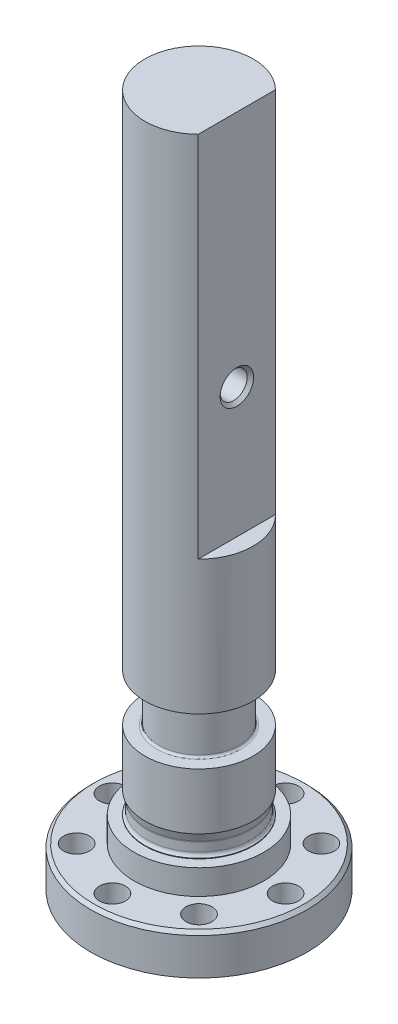
ISO-10303-21;
HEADER;
FILE_DESCRIPTION(('STEP AP214'),'2;1');
FILE_NAME('part.step','',(''),(''),'','','');
FILE_SCHEMA(('AUTOMOTIVE_DESIGN { 1 0 10303 214 1 1 1 1 }'));
ENDSEC;
DATA;
#1=APPLICATION_CONTEXT('core data for automotive mechanical design processes');
#2=APPLICATION_PROTOCOL_DEFINITION('international standard','automotive_design',2000,#1);
#3=PRODUCT_CONTEXT('',#1,'mechanical');
#4=PRODUCT('Part','Part','',(#3));
#5=PRODUCT_RELATED_PRODUCT_CATEGORY('part','',(#4));
#6=PRODUCT_DEFINITION_FORMATION('','',#4);
#7=PRODUCT_DEFINITION_CONTEXT('part definition',#1,'design');
#8=PRODUCT_DEFINITION('design','',#6,#7);
#9=PRODUCT_DEFINITION_SHAPE('','',#8);
#10=(LENGTH_UNIT() NAMED_UNIT(*) SI_UNIT(.MILLI.,.METRE.));
#11=(NAMED_UNIT(*) PLANE_ANGLE_UNIT() SI_UNIT($,.RADIAN.));
#12=(NAMED_UNIT(*) SI_UNIT($,.STERADIAN.) SOLID_ANGLE_UNIT());
#13=UNCERTAINTY_MEASURE_WITH_UNIT(LENGTH_MEASURE(1.E-05),#10,'distance_accuracy_value','');
#14=(GEOMETRIC_REPRESENTATION_CONTEXT(3) GLOBAL_UNCERTAINTY_ASSIGNED_CONTEXT((#13)) GLOBAL_UNIT_ASSIGNED_CONTEXT((#10,
#11,#12)) REPRESENTATION_CONTEXT('',''));
#15=CARTESIAN_POINT('',(0.,0.,0.));
#16=DIRECTION('',(0.,0.,1.));
#17=DIRECTION('',(1.,0.,0.));
#18=AXIS2_PLACEMENT_3D('',#15,#16,#17);
#19=CARTESIAN_POINT('',(0.,64.,0.));
#20=DIRECTION('',(0.,-1.,0.));
#21=DIRECTION('',(0.,0.,-1.));
#22=AXIS2_PLACEMENT_3D('',#19,#20,#21);
#23=CYLINDRICAL_SURFACE('',#22,5.);
#24=CARTESIAN_POINT('',(0.,8.,0.));
#25=DIRECTION('',(0.,-1.,0.));
#26=DIRECTION('',(0.,0.,-1.));
#27=AXIS2_PLACEMENT_3D('',#24,#25,#26);
#28=CIRCLE('',#27,5.);
#29=CARTESIAN_POINT('',(0.,8.,-5.));
#30=VERTEX_POINT('',#29);
#31=EDGE_CURVE('E145',#30,#30,#28,.T.);
#32=ORIENTED_EDGE('',*,*,#31,.F.);
#33=EDGE_LOOP('',(#32));
#34=FACE_BOUND('',#33,.T.);
#35=CARTESIAN_POINT('',(0.,13.2,0.));
#36=DIRECTION('',(0.,-1.,0.));
#37=DIRECTION('',(0.,0.,-1.));
#38=AXIS2_PLACEMENT_3D('',#35,#36,#37);
#39=CIRCLE('',#38,5.);
#40=CARTESIAN_POINT('',(0.,13.2,-5.));
#41=VERTEX_POINT('',#40);
#42=EDGE_CURVE('E160',#41,#41,#39,.T.);
#43=ORIENTED_EDGE('',*,*,#42,.T.);
#44=EDGE_LOOP('',(#43));
#45=FACE_BOUND('',#44,.T.);
#46=ADVANCED_FACE('F19',(#34,#45),#23,.T.);
#47=CARTESIAN_POINT('',(0.,6.,0.));
#48=DIRECTION('',(0.,1.,0.));
#49=DIRECTION('',(0.,0.,1.));
#50=AXIS2_PLACEMENT_3D('',#47,#48,#49);
#51=CIRCLE('',#50,5.);
#52=CARTESIAN_POINT('',(0.,6.,5.));
#53=VERTEX_POINT('',#52);
#54=EDGE_CURVE('E80',#53,#53,#51,.T.);
#55=ORIENTED_EDGE('',*,*,#54,.T.);
#56=EDGE_LOOP('',(#55));
#57=FACE_BOUND('',#56,.T.);
#58=CARTESIAN_POINT('',(0.,6.05358983848622,0.));
#59=DIRECTION('',(0.,1.,0.));
#60=DIRECTION('',(0.,0.,1.));
#61=AXIS2_PLACEMENT_3D('',#58,#59,#60);
#62=CIRCLE('',#61,5.);
#63=CARTESIAN_POINT('',(0.,6.05358983848622,5.));
#64=VERTEX_POINT('',#63);
#65=EDGE_CURVE('E140',#64,#64,#62,.T.);
#66=ORIENTED_EDGE('',*,*,#65,.F.);
#67=EDGE_LOOP('',(#66));
#68=FACE_BOUND('',#67,.T.);
#69=ADVANCED_FACE('F227',(#57,#68),#23,.T.);
#70=CARTESIAN_POINT('',(0.,6.,0.));
#71=DIRECTION('',(0.,1.,0.));
#72=DIRECTION('',(0.,0.,1.));
#73=AXIS2_PLACEMENT_3D('',#70,#71,#72);
#74=PLANE('',#73);
#75=CARTESIAN_POINT('',(0.,6.,0.));
#76=DIRECTION('',(0.,-1.,0.));
#77=DIRECTION('',(0.,0.,-1.));
#78=AXIS2_PLACEMENT_3D('',#75,#76,#77);
#79=CIRCLE('',#78,6.);
#80=CARTESIAN_POINT('',(0.,6.,-6.));
#81=VERTEX_POINT('',#80);
#82=EDGE_CURVE('E144',#81,#81,#79,.T.);
#83=ORIENTED_EDGE('',*,*,#82,.F.);
#84=EDGE_LOOP('',(#83));
#85=FACE_BOUND('',#84,.T.);
#86=ORIENTED_EDGE('',*,*,#54,.F.);
#87=EDGE_LOOP('',(#86));
#88=FACE_BOUND('',#87,.T.);
#89=ADVANCED_FACE('F219',(#85,#88),#74,.T.);
#90=CARTESIAN_POINT('',(-10.,3.7,0.));
#91=DIRECTION('',(0.,1.,0.));
#92=DIRECTION('',(0.,0.,1.));
#93=AXIS2_PLACEMENT_3D('',#90,#91,#92);
#94=PLANE('',#93);
#95=CARTESIAN_POINT('',(0.,3.7,0.));
#96=DIRECTION('',(0.,1.,0.));
#97=DIRECTION('',(0.,0.,1.));
#98=AXIS2_PLACEMENT_3D('',#95,#96,#97);
#99=CIRCLE('',#98,9.7);
#100=CARTESIAN_POINT('',(0.,3.7,9.7));
#101=VERTEX_POINT('',#100);
#102=EDGE_CURVE('E135',#101,#101,#99,.T.);
#103=ORIENTED_EDGE('',*,*,#102,.T.);
#104=EDGE_LOOP('',(#103));
#105=FACE_BOUND('',#104,.T.);
#106=CARTESIAN_POINT('',(0.,3.7,-8.));
#107=DIRECTION('',(0.,1.,0.));
#108=DIRECTION('',(0.,0.,1.));
#109=AXIS2_PLACEMENT_3D('',#106,#107,#108);
#110=CIRCLE('',#109,1.2);
#111=CARTESIAN_POINT('',(0.,3.7,-6.8));
#112=VERTEX_POINT('',#111);
#113=EDGE_CURVE('E89',#112,#112,#110,.T.);
#114=ORIENTED_EDGE('',*,*,#113,.F.);
#115=EDGE_LOOP('',(#114));
#116=FACE_BOUND('',#115,.T.);
#117=CARTESIAN_POINT('',(5.65685424949238,3.7,-5.65685424949238));
#118=DIRECTION('',(0.,1.,0.));
#119=DIRECTION('',(0.,0.,1.));
#120=AXIS2_PLACEMENT_3D('',#117,#118,#119);
#121=CIRCLE('',#120,1.2);
#122=CARTESIAN_POINT('',(5.65685424949238,3.7,-4.45685424949238));
#123=VERTEX_POINT('',#122);
#124=EDGE_CURVE('E303',#123,#123,#121,.T.);
#125=ORIENTED_EDGE('',*,*,#124,.F.);
#126=EDGE_LOOP('',(#125));
#127=FACE_BOUND('',#126,.T.);
#128=CARTESIAN_POINT('',(8.,3.7,0.));
#129=DIRECTION('',(0.,1.,0.));
#130=DIRECTION('',(0.,0.,1.));
#131=AXIS2_PLACEMENT_3D('',#128,#129,#130);
#132=CIRCLE('',#131,1.2);
#133=CARTESIAN_POINT('',(8.,3.7,1.2));
#134=VERTEX_POINT('',#133);
#135=EDGE_CURVE('E300',#134,#134,#132,.T.);
#136=ORIENTED_EDGE('',*,*,#135,.F.);
#137=EDGE_LOOP('',(#136));
#138=FACE_BOUND('',#137,.T.);
#139=CARTESIAN_POINT('',(5.65685424949238,3.7,5.65685424949238));
#140=DIRECTION('',(0.,1.,0.));
#141=DIRECTION('',(0.,0.,1.));
#142=AXIS2_PLACEMENT_3D('',#139,#140,#141);
#143=CIRCLE('',#142,1.2);
#144=CARTESIAN_POINT('',(5.65685424949238,3.7,6.85685424949238));
#145=VERTEX_POINT('',#144);
#146=EDGE_CURVE('E296',#145,#145,#143,.T.);
#147=ORIENTED_EDGE('',*,*,#146,.F.);
#148=EDGE_LOOP('',(#147));
#149=FACE_BOUND('',#148,.T.);
#150=CARTESIAN_POINT('',(0.,3.7,8.));
#151=DIRECTION('',(0.,1.,0.));
#152=DIRECTION('',(0.,0.,1.));
#153=AXIS2_PLACEMENT_3D('',#150,#151,#152);
#154=CIRCLE('',#153,1.2);
#155=CARTESIAN_POINT('',(0.,3.7,9.2));
#156=VERTEX_POINT('',#155);
#157=EDGE_CURVE('E292',#156,#156,#154,.T.);
#158=ORIENTED_EDGE('',*,*,#157,.F.);
#159=EDGE_LOOP('',(#158));
#160=FACE_BOUND('',#159,.T.);
#161=CARTESIAN_POINT('',(-5.65685424949238,3.7,5.65685424949238));
#162=DIRECTION('',(0.,1.,0.));
#163=DIRECTION('',(0.,0.,1.));
#164=AXIS2_PLACEMENT_3D('',#161,#162,#163);
#165=CIRCLE('',#164,1.2);
#166=CARTESIAN_POINT('',(-5.65685424949238,3.7,6.85685424949238));
#167=VERTEX_POINT('',#166);
#168=EDGE_CURVE('E288',#167,#167,#165,.T.);
#169=ORIENTED_EDGE('',*,*,#168,.F.);
#170=EDGE_LOOP('',(#169));
#171=FACE_BOUND('',#170,.T.);
#172=CARTESIAN_POINT('',(-8.,3.7,0.));
#173=DIRECTION('',(0.,1.,0.));
#174=DIRECTION('',(0.,0.,1.));
#175=AXIS2_PLACEMENT_3D('',#172,#173,#174);
#176=CIRCLE('',#175,1.2);
#177=CARTESIAN_POINT('',(-8.,3.7,1.2));
#178=VERTEX_POINT('',#177);
#179=EDGE_CURVE('E130',#178,#178,#176,.T.);
#180=ORIENTED_EDGE('',*,*,#179,.F.);
#181=EDGE_LOOP('',(#180));
#182=FACE_BOUND('',#181,.T.);
#183=CARTESIAN_POINT('',(-5.65685424949238,3.7,-5.65685424949238));
#184=DIRECTION('',(0.,1.,0.));
#185=DIRECTION('',(0.,0.,1.));
#186=AXIS2_PLACEMENT_3D('',#183,#184,#185);
#187=CIRCLE('',#186,1.2);
#188=CARTESIAN_POINT('',(-5.65685424949238,3.7,-4.45685424949238));
#189=VERTEX_POINT('',#188);
#190=EDGE_CURVE('E126',#189,#189,#187,.T.);
#191=ORIENTED_EDGE('',*,*,#190,.F.);
#192=EDGE_LOOP('',(#191));
#193=FACE_BOUND('',#192,.T.);
#194=CARTESIAN_POINT('',(0.,3.7,0.));
#195=DIRECTION('',(0.,-1.,0.));
#196=DIRECTION('',(0.,0.,-1.));
#197=AXIS2_PLACEMENT_3D('',#194,#195,#196);
#198=CIRCLE('',#197,6.);
#199=CARTESIAN_POINT('',(0.,3.7,-6.));
#200=VERTEX_POINT('',#199);
#201=EDGE_CURVE('E131',#200,#200,#198,.T.);
#202=ORIENTED_EDGE('',*,*,#201,.T.);
#203=EDGE_LOOP('',(#202));
#204=FACE_BOUND('',#203,.T.);
#205=ADVANCED_FACE('F216',(#105,#116,#127,#138,#149,#160,#171,#182,#193,#204),#94,.T.);
#206=CARTESIAN_POINT('',(0.,0.,0.));
#207=DIRECTION('',(0.,-1.,0.));
#208=DIRECTION('',(0.,0.,-1.));
#209=AXIS2_PLACEMENT_3D('',#206,#207,#208);
#210=CYLINDRICAL_SURFACE('',#209,6.);
#211=ORIENTED_EDGE('',*,*,#82,.T.);
#212=EDGE_LOOP('',(#211));
#213=FACE_BOUND('',#212,.T.);
#214=ORIENTED_EDGE('',*,*,#201,.F.);
#215=EDGE_LOOP('',(#214));
#216=FACE_BOUND('',#215,.T.);
#217=ADVANCED_FACE('F212',(#213,#216),#210,.T.);
#218=CARTESIAN_POINT('',(-5.65685424949238,6.,5.65685424949238));
#219=DIRECTION('',(0.,-1.,0.));
#220=DIRECTION('',(0.,0.,-1.));
#221=AXIS2_PLACEMENT_3D('',#218,#219,#220);
#222=CYLINDRICAL_SURFACE('',#221,1.2);
#223=CARTESIAN_POINT('',(-5.65685424949238,0.,5.65685424949238));
#224=DIRECTION('',(0.,1.,0.));
#225=DIRECTION('',(0.,0.,1.));
#226=AXIS2_PLACEMENT_3D('',#223,#224,#225);
#227=CIRCLE('',#226,1.2);
#228=CARTESIAN_POINT('',(-5.65685424949238,0.,6.85685424949238));
#229=VERTEX_POINT('',#228);
#230=EDGE_CURVE('E97',#229,#229,#227,.T.);
#231=ORIENTED_EDGE('',*,*,#230,.F.);
#232=EDGE_LOOP('',(#231));
#233=FACE_BOUND('',#232,.T.);
#234=ORIENTED_EDGE('',*,*,#168,.T.);
#235=EDGE_LOOP('',(#234));
#236=FACE_BOUND('',#235,.T.);
#237=ADVANCED_FACE('F215',(#233,#236),#222,.F.);
#238=CARTESIAN_POINT('',(5.65685424949238,6.,5.65685424949238));
#239=DIRECTION('',(0.,-1.,0.));
#240=DIRECTION('',(0.,0.,-1.));
#241=AXIS2_PLACEMENT_3D('',#238,#239,#240);
#242=CYLINDRICAL_SURFACE('',#241,1.2);
#243=CARTESIAN_POINT('',(5.65685424949238,0.,5.65685424949238));
#244=DIRECTION('',(0.,1.,0.));
#245=DIRECTION('',(0.,0.,1.));
#246=AXIS2_PLACEMENT_3D('',#243,#244,#245);
#247=CIRCLE('',#246,1.2);
#248=CARTESIAN_POINT('',(5.65685424949238,0.,6.85685424949238));
#249=VERTEX_POINT('',#248);
#250=EDGE_CURVE('E105',#249,#249,#247,.T.);
#251=ORIENTED_EDGE('',*,*,#250,.F.);
#252=EDGE_LOOP('',(#251));
#253=FACE_BOUND('',#252,.T.);
#254=ORIENTED_EDGE('',*,*,#146,.T.);
#255=EDGE_LOOP('',(#254));
#256=FACE_BOUND('',#255,.T.);
#257=ADVANCED_FACE('F354',(#253,#256),#242,.F.);
#258=CARTESIAN_POINT('',(5.65685424949238,6.,-5.65685424949238));
#259=DIRECTION('',(0.,-1.,0.));
#260=DIRECTION('',(0.,0.,-1.));
#261=AXIS2_PLACEMENT_3D('',#258,#259,#260);
#262=CYLINDRICAL_SURFACE('',#261,1.2);
#263=CARTESIAN_POINT('',(5.65685424949238,0.,-5.65685424949238));
#264=DIRECTION('',(0.,1.,0.));
#265=DIRECTION('',(0.,0.,1.));
#266=AXIS2_PLACEMENT_3D('',#263,#264,#265);
#267=CIRCLE('',#266,1.2);
#268=CARTESIAN_POINT('',(5.65685424949238,0.,-4.45685424949238));
#269=VERTEX_POINT('',#268);
#270=EDGE_CURVE('E113',#269,#269,#267,.T.);
#271=ORIENTED_EDGE('',*,*,#270,.F.);
#272=EDGE_LOOP('',(#271));
#273=FACE_BOUND('',#272,.T.);
#274=ORIENTED_EDGE('',*,*,#124,.T.);
#275=EDGE_LOOP('',(#274));
#276=FACE_BOUND('',#275,.T.);
#277=ADVANCED_FACE('F362',(#273,#276),#262,.F.);
#278=CARTESIAN_POINT('',(0.,6.,0.));
#279=DIRECTION('',(0.,-1.,0.));
#280=DIRECTION('',(0.,0.,-1.));
#281=AXIS2_PLACEMENT_3D('',#278,#279,#280);
#282=CYLINDRICAL_SURFACE('',#281,10.);
#283=CARTESIAN_POINT('',(0.,3.4,0.));
#284=DIRECTION('',(0.,1.,0.));
#285=DIRECTION('',(0.,0.,1.));
#286=AXIS2_PLACEMENT_3D('',#283,#284,#285);
#287=CIRCLE('',#286,10.);
#288=CARTESIAN_POINT('',(0.,3.4,10.));
#289=VERTEX_POINT('',#288);
#290=EDGE_CURVE('E125',#289,#289,#287,.F.);
#291=ORIENTED_EDGE('',*,*,#290,.T.);
#292=EDGE_LOOP('',(#291));
#293=FACE_BOUND('',#292,.T.);
#294=CARTESIAN_POINT('',(0.,0.,0.));
#295=DIRECTION('',(0.,1.,0.));
#296=DIRECTION('',(0.,0.,1.));
#297=AXIS2_PLACEMENT_3D('',#294,#295,#296);
#298=CIRCLE('',#297,10.);
#299=CARTESIAN_POINT('',(0.,0.,10.));
#300=VERTEX_POINT('',#299);
#301=EDGE_CURVE('E121',#300,#300,#298,.T.);
#302=ORIENTED_EDGE('',*,*,#301,.T.);
#303=EDGE_LOOP('',(#302));
#304=FACE_BOUND('',#303,.T.);
#305=ADVANCED_FACE('F369',(#293,#304),#282,.T.);
#306=CARTESIAN_POINT('',(0.,6.,-8.));
#307=DIRECTION('',(0.,-1.,0.));
#308=DIRECTION('',(0.,0.,-1.));
#309=AXIS2_PLACEMENT_3D('',#306,#307,#308);
#310=CYLINDRICAL_SURFACE('',#309,1.2);
#311=CARTESIAN_POINT('',(0.,0.,-8.));
#312=DIRECTION('',(0.,1.,0.));
#313=DIRECTION('',(0.,0.,1.));
#314=AXIS2_PLACEMENT_3D('',#311,#312,#313);
#315=CIRCLE('',#314,1.2);
#316=CARTESIAN_POINT('',(0.,0.,-6.8));
#317=VERTEX_POINT('',#316);
#318=EDGE_CURVE('E117',#317,#317,#315,.T.);
#319=ORIENTED_EDGE('',*,*,#318,.F.);
#320=EDGE_LOOP('',(#319));
#321=FACE_BOUND('',#320,.T.);
#322=ORIENTED_EDGE('',*,*,#113,.T.);
#323=EDGE_LOOP('',(#322));
#324=FACE_BOUND('',#323,.T.);
#325=ADVANCED_FACE('F314',(#321,#324),#310,.F.);
#326=CARTESIAN_POINT('',(8.,6.,0.));
#327=DIRECTION('',(0.,-1.,0.));
#328=DIRECTION('',(0.,0.,-1.));
#329=AXIS2_PLACEMENT_3D('',#326,#327,#328);
#330=CYLINDRICAL_SURFACE('',#329,1.2);
#331=CARTESIAN_POINT('',(8.,0.,0.));
#332=DIRECTION('',(0.,1.,0.));
#333=DIRECTION('',(0.,0.,1.));
#334=AXIS2_PLACEMENT_3D('',#331,#332,#333);
#335=CIRCLE('',#334,1.2);
#336=CARTESIAN_POINT('',(8.,0.,1.2));
#337=VERTEX_POINT('',#336);
#338=EDGE_CURVE('E109',#337,#337,#335,.T.);
#339=ORIENTED_EDGE('',*,*,#338,.F.);
#340=EDGE_LOOP('',(#339));
#341=FACE_BOUND('',#340,.T.);
#342=ORIENTED_EDGE('',*,*,#135,.T.);
#343=EDGE_LOOP('',(#342));
#344=FACE_BOUND('',#343,.T.);
#345=ADVANCED_FACE('F358',(#341,#344),#330,.F.);
#346=CARTESIAN_POINT('',(0.,6.,8.));
#347=DIRECTION('',(0.,-1.,0.));
#348=DIRECTION('',(0.,0.,-1.));
#349=AXIS2_PLACEMENT_3D('',#346,#347,#348);
#350=CYLINDRICAL_SURFACE('',#349,1.2);
#351=CARTESIAN_POINT('',(0.,0.,8.));
#352=DIRECTION('',(0.,1.,0.));
#353=DIRECTION('',(0.,0.,1.));
#354=AXIS2_PLACEMENT_3D('',#351,#352,#353);
#355=CIRCLE('',#354,1.2);
#356=CARTESIAN_POINT('',(0.,0.,9.2));
#357=VERTEX_POINT('',#356);
#358=EDGE_CURVE('E101',#357,#357,#355,.T.);
#359=ORIENTED_EDGE('',*,*,#358,.F.);
#360=EDGE_LOOP('',(#359));
#361=FACE_BOUND('',#360,.T.);
#362=ORIENTED_EDGE('',*,*,#157,.T.);
#363=EDGE_LOOP('',(#362));
#364=FACE_BOUND('',#363,.T.);
#365=ADVANCED_FACE('F350',(#361,#364),#350,.F.);
#366=CARTESIAN_POINT('',(-8.,6.,0.));
#367=DIRECTION('',(0.,-1.,0.));
#368=DIRECTION('',(0.,0.,-1.));
#369=AXIS2_PLACEMENT_3D('',#366,#367,#368);
#370=CYLINDRICAL_SURFACE('',#369,1.2);
#371=CARTESIAN_POINT('',(-8.,0.,0.));
#372=DIRECTION('',(0.,1.,0.));
#373=DIRECTION('',(0.,0.,1.));
#374=AXIS2_PLACEMENT_3D('',#371,#372,#373);
#375=CIRCLE('',#374,1.2);
#376=CARTESIAN_POINT('',(-8.,0.,1.2));
#377=VERTEX_POINT('',#376);
#378=EDGE_CURVE('E86',#377,#377,#375,.T.);
#379=ORIENTED_EDGE('',*,*,#378,.F.);
#380=EDGE_LOOP('',(#379));
#381=FACE_BOUND('',#380,.T.);
#382=ORIENTED_EDGE('',*,*,#179,.T.);
#383=EDGE_LOOP('',(#382));
#384=FACE_BOUND('',#383,.T.);
#385=ADVANCED_FACE('F343',(#381,#384),#370,.F.);
#386=CARTESIAN_POINT('',(0.,0.,0.));
#387=DIRECTION('',(0.,1.,0.));
#388=DIRECTION('',(0.,0.,1.));
#389=AXIS2_PLACEMENT_3D('',#386,#387,#388);
#390=PLANE('',#389);
#391=CARTESIAN_POINT('',(0.,0.,0.));
#392=DIRECTION('',(0.,-1.,0.));
#393=DIRECTION('',(0.,0.,-1.));
#394=AXIS2_PLACEMENT_3D('',#391,#392,#393);
#395=CIRCLE('',#394,4.05);
#396=CARTESIAN_POINT('',(0.,0.,-4.05));
#397=VERTEX_POINT('',#396);
#398=EDGE_CURVE('E150',#397,#397,#395,.T.);
#399=ORIENTED_EDGE('',*,*,#398,.F.);
#400=EDGE_LOOP('',(#399));
#401=FACE_BOUND('',#400,.T.);
#402=ORIENTED_EDGE('',*,*,#378,.T.);
#403=EDGE_LOOP('',(#402));
#404=FACE_BOUND('',#403,.T.);
#405=ORIENTED_EDGE('',*,*,#358,.T.);
#406=EDGE_LOOP('',(#405));
#407=FACE_BOUND('',#406,.T.);
#408=ORIENTED_EDGE('',*,*,#338,.T.);
#409=EDGE_LOOP('',(#408));
#410=FACE_BOUND('',#409,.T.);
#411=ORIENTED_EDGE('',*,*,#318,.T.);
#412=EDGE_LOOP('',(#411));
#413=FACE_BOUND('',#412,.T.);
#414=ORIENTED_EDGE('',*,*,#301,.F.);
#415=EDGE_LOOP('',(#414));
#416=FACE_BOUND('',#415,.T.);
#417=ORIENTED_EDGE('',*,*,#270,.T.);
#418=EDGE_LOOP('',(#417));
#419=FACE_BOUND('',#418,.T.);
#420=ORIENTED_EDGE('',*,*,#250,.T.);
#421=EDGE_LOOP('',(#420));
#422=FACE_BOUND('',#421,.T.);
#423=ORIENTED_EDGE('',*,*,#230,.T.);
#424=EDGE_LOOP('',(#423));
#425=FACE_BOUND('',#424,.T.);
#426=CARTESIAN_POINT('',(-5.65685424949238,0.,-5.65685424949238));
#427=DIRECTION('',(0.,1.,0.));
#428=DIRECTION('',(0.,0.,1.));
#429=AXIS2_PLACEMENT_3D('',#426,#427,#428);
#430=CIRCLE('',#429,1.2);
#431=CARTESIAN_POINT('',(-5.65685424949238,0.,-4.45685424949238));
#432=VERTEX_POINT('',#431);
#433=EDGE_CURVE('E79',#432,#432,#430,.T.);
#434=ORIENTED_EDGE('',*,*,#433,.T.);
#435=EDGE_LOOP('',(#434));
#436=FACE_BOUND('',#435,.T.);
#437=ADVANCED_FACE('F335',(#401,#404,#407,#410,#413,#416,#419,#422,#425,#436),#390,.F.);
#438=CARTESIAN_POINT('',(-5.65685424949238,6.,-5.65685424949238));
#439=DIRECTION('',(0.,-1.,0.));
#440=DIRECTION('',(0.,0.,-1.));
#441=AXIS2_PLACEMENT_3D('',#438,#439,#440);
#442=CYLINDRICAL_SURFACE('',#441,1.2);
#443=ORIENTED_EDGE('',*,*,#433,.F.);
#444=EDGE_LOOP('',(#443));
#445=FACE_BOUND('',#444,.T.);
#446=ORIENTED_EDGE('',*,*,#190,.T.);
#447=EDGE_LOOP('',(#446));
#448=FACE_BOUND('',#447,.T.);
#449=ADVANCED_FACE('F333',(#445,#448),#442,.F.);
#450=CARTESIAN_POINT('',(0.,3.4,0.));
#451=DIRECTION('',(0.,-1.,0.));
#452=DIRECTION('',(0.,0.,-1.));
#453=AXIS2_PLACEMENT_3D('',#450,#451,#452);
#454=CONICAL_SURFACE('',#453,10.,0.78539816339744);
#455=ORIENTED_EDGE('',*,*,#102,.F.);
#456=EDGE_LOOP('',(#455));
#457=FACE_BOUND('',#456,.T.);
#458=ORIENTED_EDGE('',*,*,#290,.F.);
#459=EDGE_LOOP('',(#458));
#460=FACE_BOUND('',#459,.T.);
#461=ADVANCED_FACE('F200',(#457,#460),#454,.T.);
#462=CARTESIAN_POINT('',(0.,6.4,0.));
#463=DIRECTION('',(0.,-1.,0.));
#464=DIRECTION('',(0.,0.,-1.));
#465=AXIS2_PLACEMENT_3D('',#462,#463,#464);
#466=TOROIDAL_SURFACE('',#465,5.2,0.4);
#467=CARTESIAN_POINT('',(0.,6.4,0.));
#468=DIRECTION('',(0.,-1.,0.));
#469=DIRECTION('',(0.,0.,-1.));
#470=AXIS2_PLACEMENT_3D('',#467,#468,#469);
#471=CIRCLE('',#470,4.8);
#472=CARTESIAN_POINT('',(0.,6.4,-4.8));
#473=VERTEX_POINT('',#472);
#474=EDGE_CURVE('E265',#473,#473,#471,.T.);
#475=ORIENTED_EDGE('',*,*,#474,.T.);
#476=EDGE_LOOP('',(#475));
#477=FACE_BOUND('',#476,.T.);
#478=ORIENTED_EDGE('',*,*,#65,.T.);
#479=EDGE_LOOP('',(#478));
#480=FACE_BOUND('',#479,.T.);
#481=ADVANCED_FACE('F196',(#477,#480),#466,.F.);
#482=CARTESIAN_POINT('',(0.,7.30445645749228,0.));
#483=DIRECTION('',(0.,1.,0.));
#484=DIRECTION('',(0.,0.,1.));
#485=AXIS2_PLACEMENT_3D('',#482,#483,#484);
#486=CONICAL_SURFACE('',#485,4.81362966948437,0.261799387799151);
#487=ORIENTED_EDGE('',*,*,#31,.T.);
#488=EDGE_LOOP('',(#487));
#489=FACE_BOUND('',#488,.T.);
#490=CARTESIAN_POINT('',(0.,7.30445645749228,0.));
#491=DIRECTION('',(0.,-1.,0.));
#492=DIRECTION('',(0.,0.,-1.));
#493=AXIS2_PLACEMENT_3D('',#490,#491,#492);
#494=CIRCLE('',#493,4.81362966948437);
#495=CARTESIAN_POINT('',(0.,7.30445645749228,-4.81362966948437));
#496=VERTEX_POINT('',#495);
#497=EDGE_CURVE('E273',#496,#496,#494,.T.);
#498=ORIENTED_EDGE('',*,*,#497,.F.);
#499=EDGE_LOOP('',(#498));
#500=FACE_BOUND('',#499,.T.);
#501=ADVANCED_FACE('F199',(#489,#500),#486,.T.);
#502=CARTESIAN_POINT('',(0.,7.20092883945127,0.));
#503=DIRECTION('',(0.,-1.,0.));
#504=DIRECTION('',(0.,0.,-1.));
#505=AXIS2_PLACEMENT_3D('',#502,#503,#504);
#506=TOROIDAL_SURFACE('',#505,5.2,0.4);
#507=ORIENTED_EDGE('',*,*,#497,.T.);
#508=EDGE_LOOP('',(#507));
#509=FACE_BOUND('',#508,.T.);
#510=CARTESIAN_POINT('',(0.,7.20092883945127,0.));
#511=DIRECTION('',(0.,-1.,0.));
#512=DIRECTION('',(0.,0.,-1.));
#513=AXIS2_PLACEMENT_3D('',#510,#511,#512);
#514=CIRCLE('',#513,4.8);
#515=CARTESIAN_POINT('',(0.,7.20092883945127,-4.8));
#516=VERTEX_POINT('',#515);
#517=EDGE_CURVE('E269',#516,#516,#514,.T.);
#518=ORIENTED_EDGE('',*,*,#517,.F.);
#519=EDGE_LOOP('',(#518));
#520=FACE_BOUND('',#519,.T.);
#521=ADVANCED_FACE('F204',(#509,#520),#506,.F.);
#522=CARTESIAN_POINT('',(0.,0.,0.));
#523=DIRECTION('',(0.,-1.,0.));
#524=DIRECTION('',(0.,0.,-1.));
#525=AXIS2_PLACEMENT_3D('',#522,#523,#524);
#526=CYLINDRICAL_SURFACE('',#525,4.8);
#527=ORIENTED_EDGE('',*,*,#517,.T.);
#528=EDGE_LOOP('',(#527));
#529=FACE_BOUND('',#528,.T.);
#530=ORIENTED_EDGE('',*,*,#474,.F.);
#531=EDGE_LOOP('',(#530));
#532=FACE_BOUND('',#531,.T.);
#533=ADVANCED_FACE('F194',(#529,#532),#526,.T.);
#534=CARTESIAN_POINT('',(0.,2.,0.));
#535=DIRECTION('',(0.,-1.,0.));
#536=DIRECTION('',(0.,0.,-1.));
#537=AXIS2_PLACEMENT_3D('',#534,#535,#536);
#538=CONICAL_SURFACE('',#537,4.05,1.02974425867665);
#539=CARTESIAN_POINT('',(0.,2.93133395949272,0.));
#540=DIRECTION('',(0.,-1.,0.));
#541=DIRECTION('',(0.,0.,-1.));
#542=AXIS2_PLACEMENT_3D('',#539,#540,#541);
#543=CIRCLE('',#542,2.5);
#544=CARTESIAN_POINT('',(0.,2.93133395949272,-2.5));
#545=VERTEX_POINT('',#544);
#546=EDGE_CURVE('E146',#545,#545,#543,.F.);
#547=ORIENTED_EDGE('',*,*,#546,.T.);
#548=EDGE_LOOP('',(#547));
#549=FACE_BOUND('',#548,.T.);
#550=CARTESIAN_POINT('',(0.,2.,0.));
#551=DIRECTION('',(0.,-1.,0.));
#552=DIRECTION('',(0.,0.,-1.));
#553=AXIS2_PLACEMENT_3D('',#550,#551,#552);
#554=CIRCLE('',#553,4.05);
#555=CARTESIAN_POINT('',(0.,2.,-4.05));
#556=VERTEX_POINT('',#555);
#557=EDGE_CURVE('E261',#556,#556,#554,.T.);
#558=ORIENTED_EDGE('',*,*,#557,.T.);
#559=EDGE_LOOP('',(#558));
#560=FACE_BOUND('',#559,.T.);
#561=ADVANCED_FACE('F190',(#549,#560),#538,.F.);
#562=CARTESIAN_POINT('',(0.,0.,0.));
#563=DIRECTION('',(0.,-1.,0.));
#564=DIRECTION('',(0.,0.,-1.));
#565=AXIS2_PLACEMENT_3D('',#562,#563,#564);
#566=CYLINDRICAL_SURFACE('',#565,4.05);
#567=ORIENTED_EDGE('',*,*,#557,.F.);
#568=EDGE_LOOP('',(#567));
#569=FACE_BOUND('',#568,.T.);
#570=ORIENTED_EDGE('',*,*,#398,.T.);
#571=EDGE_LOOP('',(#570));
#572=FACE_BOUND('',#571,.T.);
#573=ADVANCED_FACE('F184',(#569,#572),#566,.F.);
#574=CARTESIAN_POINT('',(0.,0.,0.));
#575=DIRECTION('',(0.,-1.,0.));
#576=DIRECTION('',(0.,0.,-1.));
#577=AXIS2_PLACEMENT_3D('',#574,#575,#576);
#578=CYLINDRICAL_SURFACE('',#577,2.5);
#579=CARTESIAN_POINT('',(0.,4.5,0.));
#580=DIRECTION('',(0.,-1.,0.));
#581=DIRECTION('',(0.,0.,-1.));
#582=AXIS2_PLACEMENT_3D('',#579,#580,#581);
#583=CIRCLE('',#582,2.5);
#584=CARTESIAN_POINT('',(0.,4.5,-2.5));
#585=VERTEX_POINT('',#584);
#586=EDGE_CURVE('E151',#585,#585,#583,.T.);
#587=ORIENTED_EDGE('',*,*,#586,.F.);
#588=EDGE_LOOP('',(#587));
#589=FACE_BOUND('',#588,.T.);
#590=ORIENTED_EDGE('',*,*,#546,.F.);
#591=EDGE_LOOP('',(#590));
#592=FACE_BOUND('',#591,.T.);
#593=ADVANCED_FACE('F180',(#589,#592),#578,.F.);
#594=CARTESIAN_POINT('',(0.,4.5,0.));
#595=DIRECTION('',(0.,-1.,0.));
#596=DIRECTION('',(0.,0.,-1.));
#597=AXIS2_PLACEMENT_3D('',#594,#595,#596);
#598=CONICAL_SURFACE('',#597,2.5,1.02974425867665);
#599=CARTESIAN_POINT('',(0.,6.0021515475689,0.));
#600=VERTEX_POINT('',#599);
#601=VERTEX_LOOP('',#600);
#602=FACE_BOUND('',#601,.T.);
#603=ORIENTED_EDGE('',*,*,#586,.T.);
#604=EDGE_LOOP('',(#603));
#605=FACE_BOUND('',#604,.T.);
#606=ADVANCED_FACE('F183',(#602,#605),#598,.F.);
#607=CARTESIAN_POINT('',(-5.,13.2,0.));
#608=DIRECTION('',(0.,1.,0.));
#609=DIRECTION('',(0.,0.,1.));
#610=AXIS2_PLACEMENT_3D('',#607,#608,#609);
#611=PLANE('',#610);
#612=CARTESIAN_POINT('',(0.,13.2,0.));
#613=DIRECTION('',(0.,1.,0.));
#614=DIRECTION('',(0.,0.,1.));
#615=AXIS2_PLACEMENT_3D('',#612,#613,#614);
#616=CIRCLE('',#615,3.9);
#617=CARTESIAN_POINT('',(0.,13.2,3.9));
#618=VERTEX_POINT('',#617);
#619=EDGE_CURVE('E394',#618,#618,#616,.F.);
#620=ORIENTED_EDGE('',*,*,#619,.T.);
#621=EDGE_LOOP('',(#620));
#622=FACE_BOUND('',#621,.T.);
#623=ORIENTED_EDGE('',*,*,#42,.F.);
#624=EDGE_LOOP('',(#623));
#625=FACE_BOUND('',#624,.T.);
#626=ADVANCED_FACE('F173',(#622,#625),#611,.T.);
#627=CARTESIAN_POINT('',(0.,0.,0.));
#628=DIRECTION('',(0.,-1.,0.));
#629=DIRECTION('',(0.,0.,-1.));
#630=AXIS2_PLACEMENT_3D('',#627,#628,#629);
#631=CYLINDRICAL_SURFACE('',#630,3.7);
#632=CARTESIAN_POINT('',(0.,13.4,0.));
#633=DIRECTION('',(0.,1.,0.));
#634=DIRECTION('',(0.,0.,1.));
#635=AXIS2_PLACEMENT_3D('',#632,#633,#634);
#636=CIRCLE('',#635,3.7);
#637=CARTESIAN_POINT('',(0.,13.4,3.7));
#638=VERTEX_POINT('',#637);
#639=EDGE_CURVE('E28',#638,#638,#636,.T.);
#640=ORIENTED_EDGE('',*,*,#639,.T.);
#641=EDGE_LOOP('',(#640));
#642=FACE_BOUND('',#641,.T.);
#643=CARTESIAN_POINT('',(0.,17.4,0.));
#644=DIRECTION('',(0.,-1.,0.));
#645=DIRECTION('',(0.,0.,-1.));
#646=AXIS2_PLACEMENT_3D('',#643,#644,#645);
#647=CIRCLE('',#646,3.7);
#648=CARTESIAN_POINT('',(0.,17.4,-3.7));
#649=VERTEX_POINT('',#648);
#650=EDGE_CURVE('E397',#649,#649,#647,.T.);
#651=ORIENTED_EDGE('',*,*,#650,.T.);
#652=EDGE_LOOP('',(#651));
#653=FACE_BOUND('',#652,.T.);
#654=ADVANCED_FACE('F409',(#642,#653),#631,.T.);
#655=CARTESIAN_POINT('',(-5.,17.6,0.));
#656=DIRECTION('',(0.,-1.,0.));
#657=DIRECTION('',(0.,0.,-1.));
#658=AXIS2_PLACEMENT_3D('',#655,#656,#657);
#659=PLANE('',#658);
#660=CARTESIAN_POINT('',(0.,17.6,0.));
#661=DIRECTION('',(0.,-1.,0.));
#662=DIRECTION('',(0.,0.,-1.));
#663=AXIS2_PLACEMENT_3D('',#660,#661,#662);
#664=CIRCLE('',#663,3.9);
#665=CARTESIAN_POINT('',(0.,17.6,-3.9));
#666=VERTEX_POINT('',#665);
#667=EDGE_CURVE('E12',#666,#666,#664,.F.);
#668=ORIENTED_EDGE('',*,*,#667,.T.);
#669=EDGE_LOOP('',(#668));
#670=FACE_BOUND('',#669,.T.);
#671=CARTESIAN_POINT('',(0.,17.6,0.));
#672=DIRECTION('',(0.,-1.,0.));
#673=DIRECTION('',(0.,0.,-1.));
#674=AXIS2_PLACEMENT_3D('',#671,#672,#673);
#675=CIRCLE('',#674,5.);
#676=CARTESIAN_POINT('',(0.,17.6,-5.));
#677=VERTEX_POINT('',#676);
#678=EDGE_CURVE('E241',#677,#677,#675,.T.);
#679=ORIENTED_EDGE('',*,*,#678,.T.);
#680=EDGE_LOOP('',(#679));
#681=FACE_BOUND('',#680,.T.);
#682=ADVANCED_FACE('F381',(#670,#681),#659,.T.);
#683=CARTESIAN_POINT('',(3.2,42.,0.));
#684=DIRECTION('',(1.,0.,0.));
#685=DIRECTION('',(0.,0.,-1.));
#686=AXIS2_PLACEMENT_3D('',#683,#684,#685);
#687=CONICAL_SURFACE('',#686,1.25,0.785398163397444);
#688=CARTESIAN_POINT('',(3.5,42.,0.));
#689=DIRECTION('',(-1.,0.,0.));
#690=DIRECTION('',(0.,0.,1.));
#691=AXIS2_PLACEMENT_3D('',#688,#689,#690);
#692=CIRCLE('',#691,1.55);
#693=CARTESIAN_POINT('',(3.5,42.,1.55));
#694=VERTEX_POINT('',#693);
#695=EDGE_CURVE('E398',#694,#694,#692,.T.);
#696=ORIENTED_EDGE('',*,*,#695,.F.);
#697=EDGE_LOOP('',(#696));
#698=FACE_BOUND('',#697,.T.);
#699=CARTESIAN_POINT('',(3.2,42.,0.));
#700=DIRECTION('',(-1.,0.,0.));
#701=DIRECTION('',(0.,0.,1.));
#702=AXIS2_PLACEMENT_3D('',#699,#700,#701);
#703=CIRCLE('',#702,1.25);
#704=CARTESIAN_POINT('',(3.2,42.,1.25));
#705=VERTEX_POINT('',#704);
#706=EDGE_CURVE('E139',#705,#705,#703,.F.);
#707=ORIENTED_EDGE('',*,*,#706,.F.);
#708=EDGE_LOOP('',(#707));
#709=FACE_BOUND('',#708,.T.);
#710=ADVANCED_FACE('F171',(#698,#709),#687,.F.);
#711=CARTESIAN_POINT('',(3.5,42.,0.));
#712=DIRECTION('',(1.,0.,0.));
#713=DIRECTION('',(0.,0.,-1.));
#714=AXIS2_PLACEMENT_3D('',#711,#712,#713);
#715=CYLINDRICAL_SURFACE('',#714,1.25);
#716=ORIENTED_EDGE('',*,*,#706,.T.);
#717=EDGE_LOOP('',(#716));
#718=FACE_BOUND('',#717,.T.);
#719=CARTESIAN_POINT('',(-4.84122918275927,42.,-1.25));
#720=CARTESIAN_POINT('',(-4.84123050042654,42.0690253754623,-1.24999803929589));
#721=CARTESIAN_POINT('',(-4.84272153006957,42.138072449339,-1.24426312274865));
#722=CARTESIAN_POINT('',(-4.84850930996624,42.274183789087,-1.22151156273207));
#723=CARTESIAN_POINT('',(-4.85280769310907,42.3412468772342,-1.2044883533711));
#724=CARTESIAN_POINT('',(-4.86369362297984,42.4714017690935,-1.15974559981597));
#725=CARTESIAN_POINT('',(-4.87027821345205,42.5344985776929,-1.13203986392723));
#726=CARTESIAN_POINT('',(-4.88499096014404,42.65515542627,-1.0667605706307));
#727=CARTESIAN_POINT('',(-4.89311918189251,42.7127152310401,-1.02918659428034));
#728=CARTESIAN_POINT('',(-4.91020358177806,42.8219308226311,-0.944354213655933));
#729=CARTESIAN_POINT('',(-4.91917298811515,42.873446800175,-0.896918443852019));
#730=CARTESIAN_POINT('',(-4.93681437757649,42.9678806971802,-0.794091032050326));
#731=CARTESIAN_POINT('',(-4.94548633283194,43.0107978128109,-0.738698647090149));
#732=CARTESIAN_POINT('',(-4.96170207760291,43.0873877338156,-0.620572600539473));
#733=CARTESIAN_POINT('',(-4.96922843700296,43.1209231940807,-0.557747288097553));
#734=CARTESIAN_POINT('',(-4.98215405962992,43.1769048220766,-0.427131592146374));
#735=CARTESIAN_POINT('',(-4.98755363667173,43.1993526259578,-0.359341942895965));
#736=CARTESIAN_POINT('',(-4.9955237942409,43.2320739172893,-0.222179379377078));
#737=CARTESIAN_POINT('',(-4.99814946922157,43.2425848221633,-0.152866359774485));
#738=CARTESIAN_POINT('',(-5.00046797053649,43.2518791896378,-0.0134144096313822));
#739=CARTESIAN_POINT('',(-5.00016123048352,43.2506643861048,0.0567243972690362));
#740=CARTESIAN_POINT('',(-4.99669047476768,43.2367125748749,0.194190308965484));
#741=CARTESIAN_POINT('',(-4.99359001170437,43.2242318374731,0.261545269501332));
#742=CARTESIAN_POINT('',(-4.98495418262427,43.1885143649758,0.393172809267108));
#743=CARTESIAN_POINT('',(-4.9794186869922,43.1652770573113,0.45744522421305));
#744=CARTESIAN_POINT('',(-4.96643754850448,43.1084987146565,0.581758379377257));
#745=CARTESIAN_POINT('',(-4.95897509847527,43.0748664776691,0.641755637208123));
#746=CARTESIAN_POINT('',(-4.94294951904825,42.9983221604419,0.755344527925604));
#747=CARTESIAN_POINT('',(-4.93438619826245,42.9554084657197,0.808935043856881));
#748=CARTESIAN_POINT('',(-4.9168185688476,42.8601456290088,0.909717543856196));
#749=CARTESIAN_POINT('',(-4.90780859762959,42.8075725538261,0.956697098843993));
#750=CARTESIAN_POINT('',(-4.89057521758353,42.6952000132299,1.04122046995376));
#751=CARTESIAN_POINT('',(-4.88235184552985,42.6354002102545,1.07876384505751));
#752=CARTESIAN_POINT('',(-4.86760248415824,42.5098549829255,1.14348516127824));
#753=CARTESIAN_POINT('',(-4.8610849186286,42.4440821348434,1.17061195871311));
#754=CARTESIAN_POINT('',(-4.85059320069979,42.3087072659618,1.21335702579542));
#755=CARTESIAN_POINT('',(-4.84661850405109,42.2391060680085,1.22897775819113));
#756=CARTESIAN_POINT('',(-4.8417767801957,42.1000202492385,1.24791481933259));
#757=CARTESIAN_POINT('',(-4.84083044546824,42.0305811033352,1.25154523695981));
#758=CARTESIAN_POINT('',(-4.8419367174052,41.8920890317109,1.24725849525777));
#759=CARTESIAN_POINT('',(-4.84398904800633,41.8230360710244,1.23934239892439));
#760=CARTESIAN_POINT('',(-4.85078540977281,41.6884428675227,1.21246273196883));
#761=CARTESIAN_POINT('',(-4.85548485117188,41.6228636367146,1.19368203414088));
#762=CARTESIAN_POINT('',(-4.86700359135481,41.4957842710742,1.14580904083531));
#763=CARTESIAN_POINT('',(-4.87382314124306,41.4342846204723,1.11671552385627));
#764=CARTESIAN_POINT('',(-4.88898068546631,41.3157793610663,1.04838533396827));
#765=CARTESIAN_POINT('',(-4.89734584303321,41.2588855799785,1.00896087691782));
#766=CARTESIAN_POINT('',(-4.91458541535858,41.1524058185993,0.921325366168076));
#767=CARTESIAN_POINT('',(-4.92345991364235,41.102821041675,0.873112868506797));
#768=CARTESIAN_POINT('',(-4.94098701515803,41.0110944787145,0.767828401230902));
#769=CARTESIAN_POINT('',(-4.94962851030918,40.9691699687256,0.710564940664492));
#770=CARTESIAN_POINT('',(-4.96548608306867,40.8955320665244,0.589628353368348));
#771=CARTESIAN_POINT('',(-4.9727022350198,40.8638181416959,0.525955561196988));
#772=CARTESIAN_POINT('',(-4.98485057869157,40.811776982736,0.394447752163859));
#773=CARTESIAN_POINT('',(-4.98979915011205,40.7913678578105,0.32664672628485));
#774=CARTESIAN_POINT('',(-4.99692646697894,40.7622698326958,0.18843720039851));
#775=CARTESIAN_POINT('',(-4.99910574696705,40.7535786706305,0.118029206301554));
#776=CARTESIAN_POINT('',(-5.00042711761014,40.7482905130306,-0.0213544080541595));
#777=CARTESIAN_POINT('',(-4.99964973600011,40.7513728636308,-0.090317283707543));
#778=CARTESIAN_POINT('',(-4.9953237057178,40.7688097841179,-0.226709370518426));
#779=CARTESIAN_POINT('',(-4.99177513946369,40.7831640187664,-0.29413862722611));
#780=CARTESIAN_POINT('',(-4.98231791067453,40.8225652747137,-0.425213794556021));
#781=CARTESIAN_POINT('',(-4.97642205628333,40.8475543166433,-0.488878118226274));
#782=CARTESIAN_POINT('',(-4.9628911114173,40.9074632237742,-0.611146316301837));
#783=CARTESIAN_POINT('',(-4.95525580172171,40.9423843408369,-0.669749551581318));
#784=CARTESIAN_POINT('',(-4.93884062101667,41.0221440424963,-0.781752410529877));
#785=CARTESIAN_POINT('',(-4.93003771182014,41.0672001786342,-0.83499373537573));
#786=CARTESIAN_POINT('',(-4.91238311316552,41.1655285649673,-0.933268775339065));
#787=CARTESIAN_POINT('',(-4.90353141190695,41.2188028951224,-0.978300406335234));
#788=CARTESIAN_POINT('',(-4.88659344825685,41.3332517677517,-1.05970253309904));
#789=CARTESIAN_POINT('',(-4.87852454662355,41.3945551542658,-1.09589577430819));
#790=CARTESIAN_POINT('',(-4.8642994443827,41.5225693624034,-1.15740862076958));
#791=CARTESIAN_POINT('',(-4.85814185308379,41.5892762076334,-1.18273613719965));
#792=CARTESIAN_POINT('',(-4.8493988592473,41.7132212647834,-1.2180281607068));
#793=CARTESIAN_POINT('',(-4.84635828750683,41.7698664554798,-1.22999146324422));
#794=CARTESIAN_POINT('',(-4.84227298231965,41.88433608625,-1.24597786571659));
#795=CARTESIAN_POINT('',(-4.84122807862454,41.9421604253063,-1.25000164296523));
#796=CARTESIAN_POINT('',(-4.84122918275927,42.,-1.25));
#797=B_SPLINE_CURVE_WITH_KNOTS('',3,(#719,#720,#721,#722,#723,#724,#725,#726,#727,#728,#729,
#730,#731,#732,#733,#734,#735,#736,#737,#738,#739,#740,#741,#742,#743,#744,#745,#746,#747,#748,
#749,#750,#751,#752,#753,#754,#755,#756,#757,#758,#759,#760,#761,#762,#763,#764,#765,#766,#767,
#768,#769,#770,#771,#772,#773,#774,#775,#776,#777,#778,#779,#780,#781,#782,#783,#784,#785,#786,
#787,#788,#789,#790,#791,#792,#793,#794,#795,#796),.UNSPECIFIED.,.T.,.F.,(4,2,2,2,2,2,2,2,2,2,2,
2,2,2,2,2,2,2,2,2,2,2,2,2,2,2,2,2,2,2,2,2,2,2,2,2,2,2,4),(0.,0.206863720868075,
0.413847870714356,0.620565363583026,0.827291633777408,1.03811977096489,1.24896760739934,
1.46275748198961,1.67651579923547,1.88594375497674,2.09534074333011,2.30009131344474,
2.50485278362393,2.71146437127222,2.91811192734455,3.13035233285955,3.34260265599901,
3.55588216004201,3.76911600064773,3.97671787380858,4.184300635919,4.38848702504604,
4.59269760710708,4.80091422929578,5.00916509442522,5.22262665482659,5.43607707859776,
5.64796036403465,5.85980274454519,6.06591723063728,6.27202558688491,6.47702438279855,
6.68204902869035,6.89198548291035,7.10197515782754,7.3158823864234,7.52963360683311,
7.70298913588666,7.8763298754976),.UNSPECIFIED.);
#798=CARTESIAN_POINT('',(-4.84122918275927,42.,-1.25));
#799=VERTEX_POINT('',#798);
#800=EDGE_CURVE('E74',#799,#799,#797,.T.);
#801=ORIENTED_EDGE('',*,*,#800,.F.);
#802=EDGE_LOOP('',(#801));
#803=FACE_BOUND('',#802,.T.);
#804=ADVANCED_FACE('F165',(#718,#803),#715,.F.);
#805=CARTESIAN_POINT('',(0.,30.,0.));
#806=DIRECTION('',(0.,1.,0.));
#807=DIRECTION('',(0.,0.,1.));
#808=AXIS2_PLACEMENT_3D('',#805,#806,#807);
#809=PLANE('',#808);
#810=CARTESIAN_POINT('',(0.,30.,0.));
#811=DIRECTION('',(0.,1.,0.));
#812=DIRECTION('',(0.,0.,1.));
#813=AXIS2_PLACEMENT_3D('',#810,#811,#812);
#814=CIRCLE('',#813,5.);
#815=CARTESIAN_POINT('',(3.5,30.,-3.57071421427142));
#816=VERTEX_POINT('',#815);
#817=CARTESIAN_POINT('',(3.5,30.,3.57071421427142));
#818=VERTEX_POINT('',#817);
#819=EDGE_CURVE('E248',#816,#818,#814,.F.);
#820=ORIENTED_EDGE('',*,*,#819,.F.);
#821=DIRECTION('',(0.,0.,-1.));
#822=VECTOR('',#821,1.);
#823=CARTESIAN_POINT('',(3.5,30.,3.57071421427142));
#824=LINE('',#823,#822);
#825=EDGE_CURVE('E38',#818,#816,#824,.T.);
#826=ORIENTED_EDGE('',*,*,#825,.F.);
#827=EDGE_LOOP('',(#820,#826));
#828=FACE_BOUND('',#827,.T.);
#829=ADVANCED_FACE('F170',(#828),#809,.T.);
#830=CARTESIAN_POINT('',(3.5,-1.29725975966322,3.57071421427142));
#831=DIRECTION('',(-1.,0.,0.));
#832=DIRECTION('',(0.,0.,1.));
#833=AXIS2_PLACEMENT_3D('',#830,#831,#832);
#834=PLANE('',#833);
#835=ORIENTED_EDGE('',*,*,#695,.T.);
#836=EDGE_LOOP('',(#835));
#837=FACE_BOUND('',#836,.T.);
#838=ORIENTED_EDGE('',*,*,#825,.T.);
#839=DIRECTION('',(0.,1.,0.));
#840=VECTOR('',#839,1.);
#841=CARTESIAN_POINT('',(3.5,-1.29725975966322,-3.57071421427142));
#842=LINE('',#841,#840);
#843=CARTESIAN_POINT('',(3.5,64.,-3.57071421427142));
#844=VERTEX_POINT('',#843);
#845=EDGE_CURVE('E58',#816,#844,#842,.T.);
#846=ORIENTED_EDGE('',*,*,#845,.T.);
#847=DIRECTION('',(0.,0.,1.));
#848=VECTOR('',#847,1.);
#849=CARTESIAN_POINT('',(3.5,64.,3.57071421427142));
#850=LINE('',#849,#848);
#851=CARTESIAN_POINT('',(3.5,64.,3.57071421427142));
#852=VERTEX_POINT('',#851);
#853=EDGE_CURVE('E61',#844,#852,#850,.T.);
#854=ORIENTED_EDGE('',*,*,#853,.T.);
#855=DIRECTION('',(0.,1.,0.));
#856=VECTOR('',#855,1.);
#857=CARTESIAN_POINT('',(3.5,-1.29725975966322,3.57071421427142));
#858=LINE('',#857,#856);
#859=EDGE_CURVE('E67',#818,#852,#858,.T.);
#860=ORIENTED_EDGE('',*,*,#859,.F.);
#861=EDGE_LOOP('',(#838,#846,#854,#860));
#862=FACE_BOUND('',#861,.T.);
#863=ADVANCED_FACE('F60',(#837,#862),#834,.F.);
#864=CARTESIAN_POINT('',(0.,64.,0.));
#865=DIRECTION('',(0.,1.,0.));
#866=DIRECTION('',(0.,0.,1.));
#867=AXIS2_PLACEMENT_3D('',#864,#865,#866);
#868=PLANE('',#867);
#869=ORIENTED_EDGE('',*,*,#853,.F.);
#870=CARTESIAN_POINT('',(0.,64.,0.));
#871=DIRECTION('',(0.,1.,0.));
#872=DIRECTION('',(0.,0.,1.));
#873=AXIS2_PLACEMENT_3D('',#870,#871,#872);
#874=CIRCLE('',#873,5.);
#875=EDGE_CURVE('E72',#844,#852,#874,.T.);
#876=ORIENTED_EDGE('',*,*,#875,.T.);
#877=EDGE_LOOP('',(#869,#876));
#878=FACE_BOUND('',#877,.T.);
#879=ADVANCED_FACE('F71',(#878),#868,.T.);
#880=ORIENTED_EDGE('',*,*,#875,.F.);
#881=ORIENTED_EDGE('',*,*,#845,.F.);
#882=ORIENTED_EDGE('',*,*,#819,.T.);
#883=ORIENTED_EDGE('',*,*,#859,.T.);
#884=EDGE_LOOP('',(#880,#881,#882,#883));
#885=FACE_BOUND('',#884,.T.);
#886=ORIENTED_EDGE('',*,*,#800,.T.);
#887=EDGE_LOOP('',(#886));
#888=FACE_BOUND('',#887,.T.);
#889=ORIENTED_EDGE('',*,*,#678,.F.);
#890=EDGE_LOOP('',(#889));
#891=FACE_BOUND('',#890,.T.);
#892=ADVANCED_FACE('F76',(#885,#888,#891),#23,.T.);
#893=CARTESIAN_POINT('',(0.,13.4,0.));
#894=DIRECTION('',(0.,1.,0.));
#895=DIRECTION('',(0.,0.,1.));
#896=AXIS2_PLACEMENT_3D('',#893,#894,#895);
#897=TOROIDAL_SURFACE('',#896,3.9,0.2);
#898=ORIENTED_EDGE('',*,*,#639,.F.);
#899=EDGE_LOOP('',(#898));
#900=FACE_BOUND('',#899,.T.);
#901=ORIENTED_EDGE('',*,*,#619,.F.);
#902=EDGE_LOOP('',(#901));
#903=FACE_BOUND('',#902,.T.);
#904=ADVANCED_FACE('F226',(#900,#903),#897,.F.);
#905=CARTESIAN_POINT('',(0.,17.4,0.));
#906=DIRECTION('',(0.,-1.,0.));
#907=DIRECTION('',(0.,0.,-1.));
#908=AXIS2_PLACEMENT_3D('',#905,#906,#907);
#909=TOROIDAL_SURFACE('',#908,3.9,0.2);
#910=ORIENTED_EDGE('',*,*,#667,.F.);
#911=EDGE_LOOP('',(#910));
#912=FACE_BOUND('',#911,.T.);
#913=ORIENTED_EDGE('',*,*,#650,.F.);
#914=EDGE_LOOP('',(#913));
#915=FACE_BOUND('',#914,.T.);
#916=ADVANCED_FACE('F21',(#912,#915),#909,.F.);
#917=CLOSED_SHELL('',(#46,#69,#89,#205,#217,#237,#257,#277,#305,#325,#345,#365,#385,#437,#449,
#461,#481,#501,#521,#533,#561,#573,#593,#606,#626,#654,#682,#710,#804,#829,#863,#879,#892,#904,#916));
#918=MANIFOLD_SOLID_BREP('B1',#917);
#919=ADVANCED_BREP_SHAPE_REPRESENTATION('',(#18,#918),#14);
#920=SHAPE_DEFINITION_REPRESENTATION(#9,#919);
ENDSEC;
END-ISO-10303-21;
